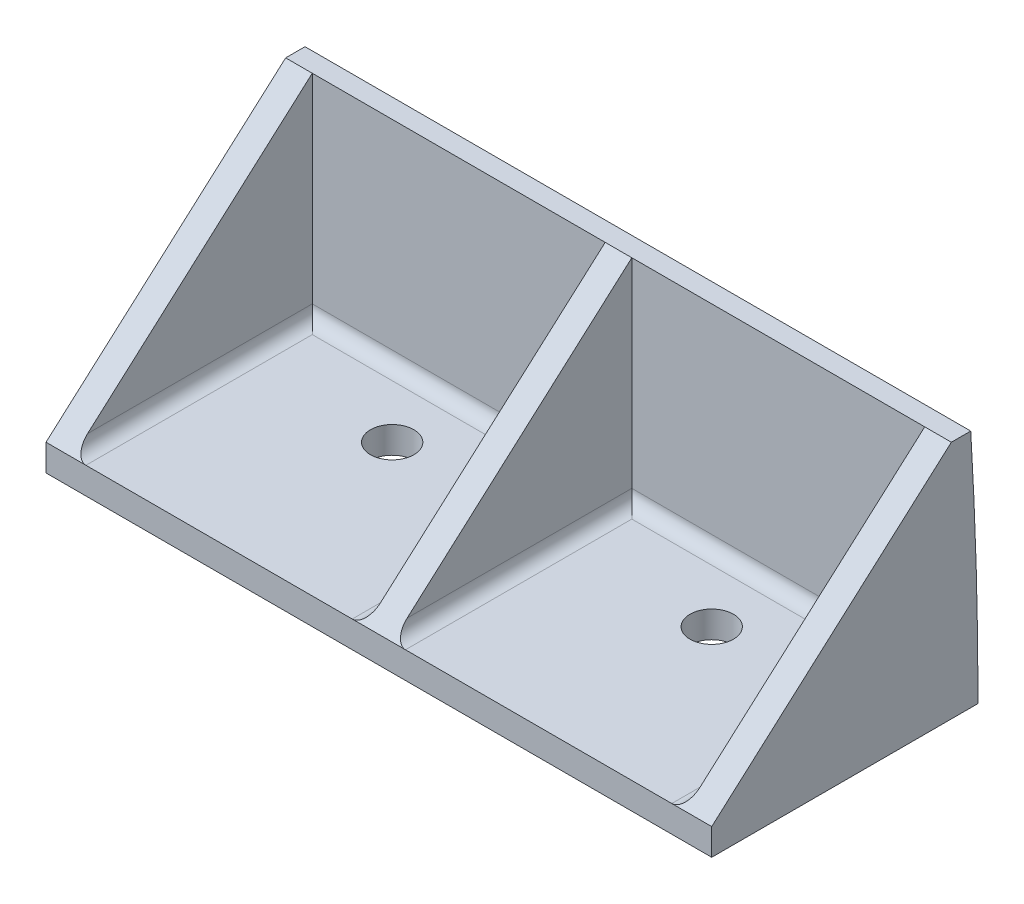
ISO-10303-21;
HEADER;
FILE_DESCRIPTION(('STEP AP214'),'2;1');
FILE_NAME('part.step','',(''),(''),'','','');
FILE_SCHEMA(('AUTOMOTIVE_DESIGN { 1 0 10303 214 1 1 1 1 }'));
ENDSEC;
DATA;
#1=APPLICATION_CONTEXT('core data for automotive mechanical design processes');
#2=APPLICATION_PROTOCOL_DEFINITION('international standard','automotive_design',2000,#1);
#3=PRODUCT_CONTEXT('',#1,'mechanical');
#4=PRODUCT('Part','Part','',(#3));
#5=PRODUCT_RELATED_PRODUCT_CATEGORY('part','',(#4));
#6=PRODUCT_DEFINITION_FORMATION('','',#4);
#7=PRODUCT_DEFINITION_CONTEXT('part definition',#1,'design');
#8=PRODUCT_DEFINITION('design','',#6,#7);
#9=PRODUCT_DEFINITION_SHAPE('','',#8);
#10=(LENGTH_UNIT() NAMED_UNIT(*) SI_UNIT(.MILLI.,.METRE.));
#11=(NAMED_UNIT(*) PLANE_ANGLE_UNIT() SI_UNIT($,.RADIAN.));
#12=(NAMED_UNIT(*) SI_UNIT($,.STERADIAN.) SOLID_ANGLE_UNIT());
#13=UNCERTAINTY_MEASURE_WITH_UNIT(LENGTH_MEASURE(1.E-05),#10,'distance_accuracy_value','');
#14=(GEOMETRIC_REPRESENTATION_CONTEXT(3) GLOBAL_UNCERTAINTY_ASSIGNED_CONTEXT((#13)) GLOBAL_UNIT_ASSIGNED_CONTEXT((#10,
#11,#12)) REPRESENTATION_CONTEXT('',''));
#15=CARTESIAN_POINT('',(0.,0.,0.));
#16=DIRECTION('',(0.,0.,1.));
#17=DIRECTION('',(1.,0.,0.));
#18=AXIS2_PLACEMENT_3D('',#15,#16,#17);
#19=CARTESIAN_POINT('',(-37.5,2.,-9.99999999999998));
#20=DIRECTION('',(-1.,0.,0.));
#21=DIRECTION('',(0.,0.,1.));
#22=AXIS2_PLACEMENT_3D('',#19,#20,#21);
#23=PLANE('',#22);
#24=CARTESIAN_POINT('',(-37.4999999999999,0.,287.));
#25=DIRECTION('',(1.,0.,0.));
#26=DIRECTION('',(0.,0.,-1.));
#27=AXIS2_PLACEMENT_3D('',#24,#25,#26);
#28=CIRCLE('',#27,297.);
#29=CARTESIAN_POINT('',(-37.5,0.,-10.));
#30=VERTEX_POINT('',#29);
#31=CARTESIAN_POINT('',(-37.5,18.,-9.45404365601088));
#32=VERTEX_POINT('',#31);
#33=EDGE_CURVE('E153',#30,#32,#28,.T.);
#34=ORIENTED_EDGE('',*,*,#33,.F.);
#35=DIRECTION('',(0.,0.,-1.));
#36=VECTOR('',#35,1.);
#37=CARTESIAN_POINT('',(-37.5,0.,-9.99999999999998));
#38=LINE('',#37,#36);
#39=CARTESIAN_POINT('',(-37.5,0.,10.));
#40=VERTEX_POINT('',#39);
#41=EDGE_CURVE('E168',#40,#30,#38,.T.);
#42=ORIENTED_EDGE('',*,*,#41,.F.);
#43=DIRECTION('',(0.,-1.,0.));
#44=VECTOR('',#43,1.);
#45=CARTESIAN_POINT('',(-37.5,2.,10.));
#46=LINE('',#45,#44);
#47=CARTESIAN_POINT('',(-37.5,2.,10.));
#48=VERTEX_POINT('',#47);
#49=EDGE_CURVE('E182',#48,#40,#46,.T.);
#50=ORIENTED_EDGE('',*,*,#49,.F.);
#51=DIRECTION('',(0.,-0.66436383882992,0.74740931868366));
#52=VECTOR('',#51,1.);
#53=CARTESIAN_POINT('',(-37.5,18.,-7.99999999999998));
#54=LINE('',#53,#52);
#55=CARTESIAN_POINT('',(-37.5,18.,-7.99999999999998));
#56=VERTEX_POINT('',#55);
#57=EDGE_CURVE('E333',#56,#48,#54,.T.);
#58=ORIENTED_EDGE('',*,*,#57,.F.);
#59=DIRECTION('',(0.,0.,-1.));
#60=VECTOR('',#59,1.);
#61=CARTESIAN_POINT('',(-37.5,18.,-9.99999999999998));
#62=LINE('',#61,#60);
#63=EDGE_CURVE('E170',#56,#32,#62,.T.);
#64=ORIENTED_EDGE('',*,*,#63,.T.);
#65=EDGE_LOOP('',(#34,#42,#50,#58,#64));
#66=FACE_BOUND('',#65,.T.);
#67=ADVANCED_FACE('F45',(#66),#23,.T.);
#68=CARTESIAN_POINT('',(-25.,2.,0.));
#69=DIRECTION('',(0.,1.,0.));
#70=DIRECTION('',(0.,0.,1.));
#71=AXIS2_PLACEMENT_3D('',#68,#69,#70);
#72=PLANE('',#71);
#73=DIRECTION('',(-1.,0.,0.));
#74=VECTOR('',#73,1.);
#75=CARTESIAN_POINT('',(-12.5,2.,10.));
#76=LINE('',#75,#74);
#77=CARTESIAN_POINT('',(-14.5,2.,10.));
#78=VERTEX_POINT('',#77);
#79=CARTESIAN_POINT('',(-34.5,2.,10.));
#80=VERTEX_POINT('',#79);
#81=EDGE_CURVE('E177',#78,#80,#76,.T.);
#82=ORIENTED_EDGE('',*,*,#81,.F.);
#83=DIRECTION('',(0.,0.,1.));
#84=VECTOR('',#83,1.);
#85=CARTESIAN_POINT('',(-14.5,2.,0.));
#86=LINE('',#85,#84);
#87=CARTESIAN_POINT('',(-14.5,2.,-7.));
#88=VERTEX_POINT('',#87);
#89=EDGE_CURVE('E292',#78,#88,#86,.F.);
#90=ORIENTED_EDGE('',*,*,#89,.T.);
#91=DIRECTION('',(-1.,0.,0.));
#92=VECTOR('',#91,1.);
#93=CARTESIAN_POINT('',(-35.5,2.,-6.99999999999999));
#94=LINE('',#93,#92);
#95=CARTESIAN_POINT('',(-34.5,2.,-6.99999999999999));
#96=VERTEX_POINT('',#95);
#97=EDGE_CURVE('E285',#88,#96,#94,.T.);
#98=ORIENTED_EDGE('',*,*,#97,.T.);
#99=DIRECTION('',(0.,0.,-1.));
#100=VECTOR('',#99,1.);
#101=CARTESIAN_POINT('',(-34.5,2.,10.));
#102=LINE('',#101,#100);
#103=EDGE_CURVE('E288',#96,#80,#102,.F.);
#104=ORIENTED_EDGE('',*,*,#103,.T.);
#105=EDGE_LOOP('',(#82,#90,#98,#104));
#106=FACE_BOUND('',#105,.T.);
#107=CARTESIAN_POINT('',(-24.5,2.,-2.99999999999999));
#108=DIRECTION('',(0.,1.,0.));
#109=DIRECTION('',(0.,0.,1.));
#110=AXIS2_PLACEMENT_3D('',#107,#108,#109);
#111=CIRCLE('',#110,1.63);
#112=CARTESIAN_POINT('',(-24.5,2.,-1.36999999999999));
#113=VERTEX_POINT('',#112);
#114=EDGE_CURVE('E318',#113,#113,#111,.F.);
#115=ORIENTED_EDGE('',*,*,#114,.T.);
#116=EDGE_LOOP('',(#115));
#117=FACE_BOUND('',#116,.T.);
#118=ADVANCED_FACE('F413',(#106,#117),#72,.T.);
#119=CARTESIAN_POINT('',(-12.5,18.,-8.));
#120=DIRECTION('',(0.,0.,1.));
#121=DIRECTION('',(1.,0.,0.));
#122=AXIS2_PLACEMENT_3D('',#119,#120,#121);
#123=PLANE('',#122);
#124=DIRECTION('',(0.,1.,0.));
#125=VECTOR('',#124,1.);
#126=CARTESIAN_POINT('',(-35.5,2.,-7.99999999999998));
#127=LINE('',#126,#125);
#128=CARTESIAN_POINT('',(-35.5,3.,-7.99999999999998));
#129=VERTEX_POINT('',#128);
#130=CARTESIAN_POINT('',(-35.5,18.,-7.99999999999999));
#131=VERTEX_POINT('',#130);
#132=EDGE_CURVE('E334',#129,#131,#127,.T.);
#133=ORIENTED_EDGE('',*,*,#132,.F.);
#134=DIRECTION('',(-1.,0.,0.));
#135=VECTOR('',#134,1.);
#136=CARTESIAN_POINT('',(-13.5,3.,-8.));
#137=LINE('',#136,#135);
#138=CARTESIAN_POINT('',(-13.5,3.,-8.));
#139=VERTEX_POINT('',#138);
#140=EDGE_CURVE('E298',#129,#139,#137,.F.);
#141=ORIENTED_EDGE('',*,*,#140,.T.);
#142=DIRECTION('',(0.,-1.,0.));
#143=VECTOR('',#142,1.);
#144=CARTESIAN_POINT('',(-13.5,18.,-8.));
#145=LINE('',#144,#143);
#146=CARTESIAN_POINT('',(-13.5,18.,-8.));
#147=VERTEX_POINT('',#146);
#148=EDGE_CURVE('E329',#147,#139,#145,.T.);
#149=ORIENTED_EDGE('',*,*,#148,.F.);
#150=DIRECTION('',(-1.,0.,0.));
#151=VECTOR('',#150,1.);
#152=CARTESIAN_POINT('',(-12.5,18.,-8.));
#153=LINE('',#152,#151);
#154=EDGE_CURVE('E178',#147,#131,#153,.T.);
#155=ORIENTED_EDGE('',*,*,#154,.T.);
#156=EDGE_LOOP('',(#133,#141,#149,#155));
#157=FACE_BOUND('',#156,.T.);
#158=ADVANCED_FACE('F407',(#157),#123,.T.);
#159=CARTESIAN_POINT('',(12.5,2.,-10.));
#160=DIRECTION('',(-1.,0.,0.));
#161=DIRECTION('',(0.,0.,1.));
#162=AXIS2_PLACEMENT_3D('',#159,#160,#161);
#163=PLANE('',#162);
#164=CARTESIAN_POINT('',(12.5000000000001,0.,287.));
#165=DIRECTION('',(1.,0.,0.));
#166=DIRECTION('',(0.,0.,-1.));
#167=AXIS2_PLACEMENT_3D('',#164,#165,#166);
#168=CIRCLE('',#167,297.);
#169=CARTESIAN_POINT('',(12.5,0.,-10.));
#170=VERTEX_POINT('',#169);
#171=CARTESIAN_POINT('',(12.5,18.,-9.45404365601088));
#172=VERTEX_POINT('',#171);
#173=EDGE_CURVE('E156',#170,#172,#168,.T.);
#174=ORIENTED_EDGE('',*,*,#173,.T.);
#175=DIRECTION('',(0.,0.,-1.));
#176=VECTOR('',#175,1.);
#177=CARTESIAN_POINT('',(12.5,18.,-10.));
#178=LINE('',#177,#176);
#179=CARTESIAN_POINT('',(12.5,18.,-8.));
#180=VERTEX_POINT('',#179);
#181=EDGE_CURVE('E231',#180,#172,#178,.T.);
#182=ORIENTED_EDGE('',*,*,#181,.F.);
#183=DIRECTION('',(0.,-0.66436383882992,0.74740931868366));
#184=VECTOR('',#183,1.);
#185=CARTESIAN_POINT('',(12.5,18.,-8.));
#186=LINE('',#185,#184);
#187=CARTESIAN_POINT('',(12.5,2.,10.));
#188=VERTEX_POINT('',#187);
#189=EDGE_CURVE('E208',#180,#188,#186,.T.);
#190=ORIENTED_EDGE('',*,*,#189,.T.);
#191=DIRECTION('',(0.,-1.,0.));
#192=VECTOR('',#191,1.);
#193=CARTESIAN_POINT('',(12.5,2.,10.));
#194=LINE('',#193,#192);
#195=CARTESIAN_POINT('',(12.5,0.,10.));
#196=VERTEX_POINT('',#195);
#197=EDGE_CURVE('E237',#188,#196,#194,.T.);
#198=ORIENTED_EDGE('',*,*,#197,.T.);
#199=DIRECTION('',(0.,0.,-1.));
#200=VECTOR('',#199,1.);
#201=CARTESIAN_POINT('',(12.5,0.,-10.));
#202=LINE('',#201,#200);
#203=EDGE_CURVE('E163',#196,#170,#202,.T.);
#204=ORIENTED_EDGE('',*,*,#203,.T.);
#205=EDGE_LOOP('',(#174,#182,#190,#198,#204));
#206=FACE_BOUND('',#205,.T.);
#207=ADVANCED_FACE('F364',(#206),#163,.F.);
#208=CARTESIAN_POINT('',(0.,18.,0.));
#209=DIRECTION('',(0.,1.,0.));
#210=DIRECTION('',(0.,0.,1.));
#211=AXIS2_PLACEMENT_3D('',#208,#209,#210);
#212=PLANE('',#211);
#213=DIRECTION('',(1.,0.,0.));
#214=VECTOR('',#213,1.);
#215=CARTESIAN_POINT('',(-12.5,18.,-9.45404365601088));
#216=LINE('',#215,#214);
#217=EDGE_CURVE('E272',#172,#32,#216,.F.);
#218=ORIENTED_EDGE('',*,*,#217,.T.);
#219=ORIENTED_EDGE('',*,*,#63,.F.);
#220=DIRECTION('',(-1.,0.,0.));
#221=VECTOR('',#220,1.);
#222=CARTESIAN_POINT('',(-35.5,18.,-7.99999999999998));
#223=LINE('',#222,#221);
#224=EDGE_CURVE('E345',#131,#56,#223,.T.);
#225=ORIENTED_EDGE('',*,*,#224,.F.);
#226=ORIENTED_EDGE('',*,*,#154,.F.);
#227=DIRECTION('',(1.,0.,0.));
#228=VECTOR('',#227,1.);
#229=CARTESIAN_POINT('',(-12.5,18.,-8.));
#230=LINE('',#229,#228);
#231=CARTESIAN_POINT('',(-11.5,18.,-8.));
#232=VERTEX_POINT('',#231);
#233=EDGE_CURVE('E227',#147,#232,#230,.T.);
#234=ORIENTED_EDGE('',*,*,#233,.T.);
#235=CARTESIAN_POINT('',(10.5,18.,-8.));
#236=VERTEX_POINT('',#235);
#237=EDGE_CURVE('E223',#232,#236,#230,.T.);
#238=ORIENTED_EDGE('',*,*,#237,.T.);
#239=DIRECTION('',(1.,0.,0.));
#240=VECTOR('',#239,1.);
#241=CARTESIAN_POINT('',(10.5,18.,-8.));
#242=LINE('',#241,#240);
#243=EDGE_CURVE('E216',#236,#180,#242,.T.);
#244=ORIENTED_EDGE('',*,*,#243,.T.);
#245=ORIENTED_EDGE('',*,*,#181,.T.);
#246=EDGE_LOOP('',(#218,#219,#225,#226,#234,#238,#244,#245));
#247=FACE_BOUND('',#246,.T.);
#248=ADVANCED_FACE('F361',(#247),#212,.T.);
#249=CARTESIAN_POINT('',(0.,2.,0.));
#250=DIRECTION('',(0.,1.,0.));
#251=DIRECTION('',(0.,0.,1.));
#252=AXIS2_PLACEMENT_3D('',#249,#250,#251);
#253=PLANE('',#252);
#254=CARTESIAN_POINT('',(-0.500000000000002,2.,-3.));
#255=DIRECTION('',(0.,1.,0.));
#256=DIRECTION('',(0.,0.,1.));
#257=AXIS2_PLACEMENT_3D('',#254,#255,#256);
#258=CIRCLE('',#257,1.63);
#259=CARTESIAN_POINT('',(-0.500000000000002,2.,-1.37));
#260=VERTEX_POINT('',#259);
#261=EDGE_CURVE('E196',#260,#260,#258,.T.);
#262=ORIENTED_EDGE('',*,*,#261,.F.);
#263=EDGE_LOOP('',(#262));
#264=FACE_BOUND('',#263,.T.);
#265=DIRECTION('',(1.,0.,0.));
#266=VECTOR('',#265,1.);
#267=CARTESIAN_POINT('',(0.,2.,-7.));
#268=LINE('',#267,#266);
#269=CARTESIAN_POINT('',(9.5,2.,-7.));
#270=VERTEX_POINT('',#269);
#271=CARTESIAN_POINT('',(-10.5,2.,-7.));
#272=VERTEX_POINT('',#271);
#273=EDGE_CURVE('E246',#270,#272,#268,.F.);
#274=ORIENTED_EDGE('',*,*,#273,.T.);
#275=DIRECTION('',(0.,0.,1.));
#276=VECTOR('',#275,1.);
#277=CARTESIAN_POINT('',(-10.5,2.,0.));
#278=LINE('',#277,#276);
#279=CARTESIAN_POINT('',(-10.5,2.,10.));
#280=VERTEX_POINT('',#279);
#281=EDGE_CURVE('E252',#272,#280,#278,.T.);
#282=ORIENTED_EDGE('',*,*,#281,.T.);
#283=DIRECTION('',(1.,0.,0.));
#284=VECTOR('',#283,1.);
#285=CARTESIAN_POINT('',(-12.5,2.,10.));
#286=LINE('',#285,#284);
#287=CARTESIAN_POINT('',(9.5,2.,10.));
#288=VERTEX_POINT('',#287);
#289=EDGE_CURVE('E238',#280,#288,#286,.T.);
#290=ORIENTED_EDGE('',*,*,#289,.T.);
#291=DIRECTION('',(0.,0.,-1.));
#292=VECTOR('',#291,1.);
#293=CARTESIAN_POINT('',(9.5,2.,-7.99999999999999));
#294=LINE('',#293,#292);
#295=EDGE_CURVE('E249',#288,#270,#294,.T.);
#296=ORIENTED_EDGE('',*,*,#295,.T.);
#297=EDGE_LOOP('',(#274,#282,#290,#296));
#298=FACE_BOUND('',#297,.T.);
#299=ADVANCED_FACE('F369',(#264,#298),#253,.T.);
#300=CARTESIAN_POINT('',(-12.5,18.,-8.));
#301=DIRECTION('',(0.,0.,-1.));
#302=DIRECTION('',(-1.,0.,0.));
#303=AXIS2_PLACEMENT_3D('',#300,#301,#302);
#304=PLANE('',#303);
#305=DIRECTION('',(0.,-1.,0.));
#306=VECTOR('',#305,1.);
#307=CARTESIAN_POINT('',(-11.5,18.,-8.));
#308=LINE('',#307,#306);
#309=CARTESIAN_POINT('',(-11.5,3.,-8.));
#310=VERTEX_POINT('',#309);
#311=EDGE_CURVE('E204',#232,#310,#308,.T.);
#312=ORIENTED_EDGE('',*,*,#311,.T.);
#313=DIRECTION('',(1.,0.,0.));
#314=VECTOR('',#313,1.);
#315=CARTESIAN_POINT('',(-12.5,3.,-8.));
#316=LINE('',#315,#314);
#317=CARTESIAN_POINT('',(10.5,3.,-7.99999999999999));
#318=VERTEX_POINT('',#317);
#319=EDGE_CURVE('E262',#310,#318,#316,.T.);
#320=ORIENTED_EDGE('',*,*,#319,.T.);
#321=DIRECTION('',(0.,1.,0.));
#322=VECTOR('',#321,1.);
#323=CARTESIAN_POINT('',(10.5,2.,-7.99999999999999));
#324=LINE('',#323,#322);
#325=EDGE_CURVE('E209',#318,#236,#324,.T.);
#326=ORIENTED_EDGE('',*,*,#325,.T.);
#327=ORIENTED_EDGE('',*,*,#237,.F.);
#328=EDGE_LOOP('',(#312,#320,#326,#327));
#329=FACE_BOUND('',#328,.T.);
#330=ADVANCED_FACE('F400',(#329),#304,.F.);
#331=CARTESIAN_POINT('',(-12.5,2.,10.));
#332=DIRECTION('',(0.,0.,-1.));
#333=DIRECTION('',(-1.,0.,0.));
#334=AXIS2_PLACEMENT_3D('',#331,#332,#333);
#335=PLANE('',#334);
#336=DIRECTION('',(1.,0.,0.));
#337=VECTOR('',#336,1.);
#338=CARTESIAN_POINT('',(-12.5,0.,10.));
#339=LINE('',#338,#337);
#340=EDGE_CURVE('E162',#40,#196,#339,.T.);
#341=ORIENTED_EDGE('',*,*,#340,.T.);
#342=ORIENTED_EDGE('',*,*,#197,.F.);
#343=DIRECTION('',(1.,0.,0.));
#344=VECTOR('',#343,1.);
#345=CARTESIAN_POINT('',(10.5,2.,10.));
#346=LINE('',#345,#344);
#347=EDGE_CURVE('E220',#288,#188,#346,.T.);
#348=ORIENTED_EDGE('',*,*,#347,.F.);
#349=ORIENTED_EDGE('',*,*,#289,.F.);
#350=EDGE_CURVE('E64',#78,#280,#286,.T.);
#351=ORIENTED_EDGE('',*,*,#350,.F.);
#352=ORIENTED_EDGE('',*,*,#81,.T.);
#353=DIRECTION('',(-1.,0.,0.));
#354=VECTOR('',#353,1.);
#355=CARTESIAN_POINT('',(-35.5,2.,10.));
#356=LINE('',#355,#354);
#357=EDGE_CURVE('E341',#80,#48,#356,.T.);
#358=ORIENTED_EDGE('',*,*,#357,.T.);
#359=ORIENTED_EDGE('',*,*,#49,.T.);
#360=EDGE_LOOP('',(#341,#342,#348,#349,#351,#352,#358,#359));
#361=FACE_BOUND('',#360,.T.);
#362=ADVANCED_FACE('F353',(#361),#335,.F.);
#363=CARTESIAN_POINT('',(0.,0.,0.));
#364=DIRECTION('',(0.,1.,0.));
#365=DIRECTION('',(0.,0.,1.));
#366=AXIS2_PLACEMENT_3D('',#363,#364,#365);
#367=PLANE('',#366);
#368=CARTESIAN_POINT('',(-24.5,0.,-2.99999999999999));
#369=DIRECTION('',(0.,-1.,0.));
#370=DIRECTION('',(0.,0.,1.));
#371=AXIS2_PLACEMENT_3D('',#368,#369,#370);
#372=CIRCLE('',#371,1.63);
#373=CARTESIAN_POINT('',(-24.5,0.,-1.36999999999999));
#374=VERTEX_POINT('',#373);
#375=EDGE_CURVE('E311',#374,#374,#372,.T.);
#376=ORIENTED_EDGE('',*,*,#375,.F.);
#377=EDGE_LOOP('',(#376));
#378=FACE_BOUND('',#377,.T.);
#379=CARTESIAN_POINT('',(-0.500000000000002,0.,-3.));
#380=DIRECTION('',(0.,1.,0.));
#381=DIRECTION('',(0.,0.,1.));
#382=AXIS2_PLACEMENT_3D('',#379,#380,#381);
#383=CIRCLE('',#382,1.63);
#384=CARTESIAN_POINT('',(-0.500000000000002,0.,-1.37));
#385=VERTEX_POINT('',#384);
#386=EDGE_CURVE('E192',#385,#385,#383,.T.);
#387=ORIENTED_EDGE('',*,*,#386,.T.);
#388=EDGE_LOOP('',(#387));
#389=FACE_BOUND('',#388,.T.);
#390=ORIENTED_EDGE('',*,*,#203,.F.);
#391=ORIENTED_EDGE('',*,*,#340,.F.);
#392=ORIENTED_EDGE('',*,*,#41,.T.);
#393=DIRECTION('',(-1.,0.,0.));
#394=VECTOR('',#393,1.);
#395=CARTESIAN_POINT('',(-12.5,0.,-10.));
#396=LINE('',#395,#394);
#397=EDGE_CURVE('E150',#170,#30,#396,.T.);
#398=ORIENTED_EDGE('',*,*,#397,.F.);
#399=EDGE_LOOP('',(#390,#391,#392,#398));
#400=FACE_BOUND('',#399,.T.);
#401=ADVANCED_FACE('F174',(#378,#389,#400),#367,.F.);
#402=CARTESIAN_POINT('',(10.5,18.,-8.));
#403=DIRECTION('',(0.,0.74740931868366,0.66436383882992));
#404=DIRECTION('',(0.,-0.66436383882992,0.74740931868366));
#405=AXIS2_PLACEMENT_3D('',#402,#403,#404);
#406=PLANE('',#405);
#407=ORIENTED_EDGE('',*,*,#189,.F.);
#408=ORIENTED_EDGE('',*,*,#243,.F.);
#409=DIRECTION('',(0.,-0.66436383882992,0.74740931868366));
#410=VECTOR('',#409,1.);
#411=CARTESIAN_POINT('',(10.5,18.,-8.));
#412=LINE('',#411,#410);
#413=CARTESIAN_POINT('',(10.5,3.,8.87500000000001));
#414=VERTEX_POINT('',#413);
#415=EDGE_CURVE('E212',#236,#414,#412,.T.);
#416=ORIENTED_EDGE('',*,*,#415,.T.);
#417=CARTESIAN_POINT('',(9.50000000000001,3.,8.87500000000001));
#418=DIRECTION('',(0.,0.74740931868366,0.66436383882992));
#419=DIRECTION('',(0.,-0.66436383882992,0.74740931868366));
#420=AXIS2_PLACEMENT_3D('',#417,#418,#419);
#421=ELLIPSE('',#420,1.50519932234904,1.);
#422=EDGE_CURVE('E268',#414,#288,#421,.F.);
#423=ORIENTED_EDGE('',*,*,#422,.T.);
#424=ORIENTED_EDGE('',*,*,#347,.T.);
#425=EDGE_LOOP('',(#407,#408,#416,#423,#424));
#426=FACE_BOUND('',#425,.T.);
#427=ADVANCED_FACE('F375',(#426),#406,.T.);
#428=CARTESIAN_POINT('',(10.5,0.,0.));
#429=DIRECTION('',(-1.,0.,0.));
#430=DIRECTION('',(0.,0.,1.));
#431=AXIS2_PLACEMENT_3D('',#428,#429,#430);
#432=PLANE('',#431);
#433=ORIENTED_EDGE('',*,*,#325,.F.);
#434=DIRECTION('',(0.,0.,-1.));
#435=VECTOR('',#434,1.);
#436=CARTESIAN_POINT('',(10.5,3.,10.));
#437=LINE('',#436,#435);
#438=EDGE_CURVE('E259',#318,#414,#437,.F.);
#439=ORIENTED_EDGE('',*,*,#438,.T.);
#440=ORIENTED_EDGE('',*,*,#415,.F.);
#441=EDGE_LOOP('',(#433,#439,#440));
#442=FACE_BOUND('',#441,.T.);
#443=ADVANCED_FACE('F448',(#442),#432,.T.);
#444=CARTESIAN_POINT('',(-11.5,2.,10.));
#445=DIRECTION('',(0.,0.74740931868366,0.66436383882992));
#446=DIRECTION('',(0.,-0.66436383882992,0.74740931868366));
#447=AXIS2_PLACEMENT_3D('',#444,#445,#446);
#448=PLANE('',#447);
#449=ORIENTED_EDGE('',*,*,#233,.F.);
#450=DIRECTION('',(0.,0.66436383882992,-0.74740931868366));
#451=VECTOR('',#450,1.);
#452=CARTESIAN_POINT('',(-13.5,2.,10.));
#453=LINE('',#452,#451);
#454=CARTESIAN_POINT('',(-13.5,3.,8.875));
#455=VERTEX_POINT('',#454);
#456=EDGE_CURVE('E324',#455,#147,#453,.T.);
#457=ORIENTED_EDGE('',*,*,#456,.F.);
#458=CARTESIAN_POINT('',(-14.5,3.,8.875));
#459=DIRECTION('',(0.,0.74740931868366,0.66436383882992));
#460=DIRECTION('',(0.,-0.66436383882992,0.74740931868366));
#461=AXIS2_PLACEMENT_3D('',#458,#459,#460);
#462=ELLIPSE('',#461,1.50519932234904,1.);
#463=EDGE_CURVE('E56',#455,#78,#462,.F.);
#464=ORIENTED_EDGE('',*,*,#463,.T.);
#465=ORIENTED_EDGE('',*,*,#350,.T.);
#466=CARTESIAN_POINT('',(-10.5,3.,8.875));
#467=DIRECTION('',(0.,0.74740931868366,0.66436383882992));
#468=DIRECTION('',(0.,-0.66436383882992,0.74740931868366));
#469=AXIS2_PLACEMENT_3D('',#466,#467,#468);
#470=ELLIPSE('',#469,1.50519932234904,1.);
#471=CARTESIAN_POINT('',(-11.5,3.,8.875));
#472=VERTEX_POINT('',#471);
#473=EDGE_CURVE('E265',#280,#472,#470,.F.);
#474=ORIENTED_EDGE('',*,*,#473,.T.);
#475=DIRECTION('',(0.,0.66436383882992,-0.74740931868366));
#476=VECTOR('',#475,1.);
#477=CARTESIAN_POINT('',(-11.5,2.,10.));
#478=LINE('',#477,#476);
#479=EDGE_CURVE('E201',#472,#232,#478,.T.);
#480=ORIENTED_EDGE('',*,*,#479,.T.);
#481=EDGE_LOOP('',(#449,#457,#464,#465,#474,#480));
#482=FACE_BOUND('',#481,.T.);
#483=ADVANCED_FACE('F393',(#482),#448,.T.);
#484=CARTESIAN_POINT('',(-11.5,0.,0.));
#485=DIRECTION('',(-1.,0.,0.));
#486=DIRECTION('',(0.,0.,1.));
#487=AXIS2_PLACEMENT_3D('',#484,#485,#486);
#488=PLANE('',#487);
#489=ORIENTED_EDGE('',*,*,#479,.F.);
#490=DIRECTION('',(0.,0.,1.));
#491=VECTOR('',#490,1.);
#492=CARTESIAN_POINT('',(-11.5,3.,0.));
#493=LINE('',#492,#491);
#494=EDGE_CURVE('E256',#472,#310,#493,.F.);
#495=ORIENTED_EDGE('',*,*,#494,.T.);
#496=ORIENTED_EDGE('',*,*,#311,.F.);
#497=EDGE_LOOP('',(#489,#495,#496));
#498=FACE_BOUND('',#497,.T.);
#499=ADVANCED_FACE('F396',(#498),#488,.F.);
#500=CARTESIAN_POINT('',(-0.500000000000002,0.,-3.));
#501=DIRECTION('',(0.,1.,0.));
#502=DIRECTION('',(0.,0.,1.));
#503=AXIS2_PLACEMENT_3D('',#500,#501,#502);
#504=CYLINDRICAL_SURFACE('',#503,1.63);
#505=ORIENTED_EDGE('',*,*,#261,.T.);
#506=EDGE_LOOP('',(#505));
#507=FACE_BOUND('',#506,.T.);
#508=ORIENTED_EDGE('',*,*,#386,.F.);
#509=EDGE_LOOP('',(#508));
#510=FACE_BOUND('',#509,.T.);
#511=ADVANCED_FACE('F440',(#507,#510),#504,.F.);
#512=CARTESIAN_POINT('',(9.5,3.,0.));
#513=DIRECTION('',(0.,0.,1.));
#514=DIRECTION('',(1.,0.,0.));
#515=AXIS2_PLACEMENT_3D('',#512,#513,#514);
#516=CYLINDRICAL_SURFACE('',#515,1.);
#517=ORIENTED_EDGE('',*,*,#422,.F.);
#518=ORIENTED_EDGE('',*,*,#438,.F.);
#519=CARTESIAN_POINT('',(9.5,3.,-7.));
#520=DIRECTION('',(0.707106781186548,0.,0.707106781186547));
#521=DIRECTION('',(-0.707106781186547,0.,0.707106781186548));
#522=AXIS2_PLACEMENT_3D('',#519,#520,#521);
#523=ELLIPSE('',#522,1.41421356237309,1.);
#524=EDGE_CURVE('E197',#270,#318,#523,.T.);
#525=ORIENTED_EDGE('',*,*,#524,.F.);
#526=ORIENTED_EDGE('',*,*,#295,.F.);
#527=EDGE_LOOP('',(#517,#518,#525,#526));
#528=FACE_BOUND('',#527,.T.);
#529=ADVANCED_FACE('F380',(#528),#516,.F.);
#530=CARTESIAN_POINT('',(-12.5,3.,-7.));
#531=DIRECTION('',(1.,0.,0.));
#532=DIRECTION('',(0.,0.,-1.));
#533=AXIS2_PLACEMENT_3D('',#530,#531,#532);
#534=CYLINDRICAL_SURFACE('',#533,1.);
#535=ORIENTED_EDGE('',*,*,#524,.T.);
#536=ORIENTED_EDGE('',*,*,#319,.F.);
#537=CARTESIAN_POINT('',(-10.5,3.,-7.));
#538=DIRECTION('',(-0.707106781186547,0.,0.707106781186548));
#539=DIRECTION('',(0.707106781186548,0.,0.707106781186547));
#540=AXIS2_PLACEMENT_3D('',#537,#538,#539);
#541=ELLIPSE('',#540,1.4142135623731,1.);
#542=EDGE_CURVE('E191',#272,#310,#541,.F.);
#543=ORIENTED_EDGE('',*,*,#542,.F.);
#544=ORIENTED_EDGE('',*,*,#273,.F.);
#545=EDGE_LOOP('',(#535,#536,#543,#544));
#546=FACE_BOUND('',#545,.T.);
#547=ADVANCED_FACE('F385',(#546),#534,.F.);
#548=CARTESIAN_POINT('',(-10.5,3.,0.));
#549=DIRECTION('',(0.,0.,1.));
#550=DIRECTION('',(1.,0.,0.));
#551=AXIS2_PLACEMENT_3D('',#548,#549,#550);
#552=CYLINDRICAL_SURFACE('',#551,1.);
#553=ORIENTED_EDGE('',*,*,#542,.T.);
#554=ORIENTED_EDGE('',*,*,#494,.F.);
#555=ORIENTED_EDGE('',*,*,#473,.F.);
#556=ORIENTED_EDGE('',*,*,#281,.F.);
#557=EDGE_LOOP('',(#553,#554,#555,#556));
#558=FACE_BOUND('',#557,.T.);
#559=ADVANCED_FACE('F389',(#558),#552,.F.);
#560=CARTESIAN_POINT('',(-12.4999999999999,0.,287.));
#561=DIRECTION('',(1.,0.,0.));
#562=DIRECTION('',(0.,0.,-1.));
#563=AXIS2_PLACEMENT_3D('',#560,#561,#562);
#564=CYLINDRICAL_SURFACE('',#563,297.);
#565=ORIENTED_EDGE('',*,*,#397,.T.);
#566=ORIENTED_EDGE('',*,*,#33,.T.);
#567=ORIENTED_EDGE('',*,*,#217,.F.);
#568=ORIENTED_EDGE('',*,*,#173,.F.);
#569=EDGE_LOOP('',(#565,#566,#567,#568));
#570=FACE_BOUND('',#569,.T.);
#571=ADVANCED_FACE('F152',(#570),#564,.T.);
#572=CARTESIAN_POINT('',(-35.5,18.,-7.99999999999998));
#573=DIRECTION('',(0.,-0.74740931868366,-0.66436383882992));
#574=DIRECTION('',(0.,0.66436383882992,-0.74740931868366));
#575=AXIS2_PLACEMENT_3D('',#572,#573,#574);
#576=PLANE('',#575);
#577=ORIENTED_EDGE('',*,*,#57,.T.);
#578=ORIENTED_EDGE('',*,*,#357,.F.);
#579=CARTESIAN_POINT('',(-34.5,3.,8.87500000000003));
#580=DIRECTION('',(0.,-0.74740931868366,-0.66436383882992));
#581=DIRECTION('',(0.,-0.66436383882992,0.74740931868366));
#582=AXIS2_PLACEMENT_3D('',#579,#580,#581);
#583=ELLIPSE('',#582,1.50519932234904,1.);
#584=CARTESIAN_POINT('',(-35.5,3.,8.87500000000003));
#585=VERTEX_POINT('',#584);
#586=EDGE_CURVE('E11',#80,#585,#583,.T.);
#587=ORIENTED_EDGE('',*,*,#586,.T.);
#588=DIRECTION('',(0.,-0.66436383882992,0.74740931868366));
#589=VECTOR('',#588,1.);
#590=CARTESIAN_POINT('',(-35.5,18.,-7.99999999999998));
#591=LINE('',#590,#589);
#592=EDGE_CURVE('E337',#131,#585,#591,.T.);
#593=ORIENTED_EDGE('',*,*,#592,.F.);
#594=ORIENTED_EDGE('',*,*,#224,.T.);
#595=EDGE_LOOP('',(#577,#578,#587,#593,#594));
#596=FACE_BOUND('',#595,.T.);
#597=ADVANCED_FACE('F356',(#596),#576,.F.);
#598=CARTESIAN_POINT('',(-35.5,0.,0.));
#599=DIRECTION('',(1.,0.,0.));
#600=DIRECTION('',(0.,0.,1.));
#601=AXIS2_PLACEMENT_3D('',#598,#599,#600);
#602=PLANE('',#601);
#603=ORIENTED_EDGE('',*,*,#592,.T.);
#604=DIRECTION('',(0.,0.,-1.));
#605=VECTOR('',#604,1.);
#606=CARTESIAN_POINT('',(-35.5,3.,-7.99999999999999));
#607=LINE('',#606,#605);
#608=EDGE_CURVE('E295',#585,#129,#607,.T.);
#609=ORIENTED_EDGE('',*,*,#608,.T.);
#610=ORIENTED_EDGE('',*,*,#132,.T.);
#611=EDGE_LOOP('',(#603,#609,#610));
#612=FACE_BOUND('',#611,.T.);
#613=ADVANCED_FACE('F419',(#612),#602,.T.);
#614=CARTESIAN_POINT('',(-13.5,0.,0.));
#615=DIRECTION('',(1.,0.,0.));
#616=DIRECTION('',(0.,0.,1.));
#617=AXIS2_PLACEMENT_3D('',#614,#615,#616);
#618=PLANE('',#617);
#619=ORIENTED_EDGE('',*,*,#148,.T.);
#620=DIRECTION('',(0.,0.,1.));
#621=VECTOR('',#620,1.);
#622=CARTESIAN_POINT('',(-13.5,3.,0.));
#623=LINE('',#622,#621);
#624=EDGE_CURVE('E281',#139,#455,#623,.T.);
#625=ORIENTED_EDGE('',*,*,#624,.T.);
#626=ORIENTED_EDGE('',*,*,#456,.T.);
#627=EDGE_LOOP('',(#619,#625,#626));
#628=FACE_BOUND('',#627,.T.);
#629=ADVANCED_FACE('F409',(#628),#618,.F.);
#630=CARTESIAN_POINT('',(-24.5,0.,-2.99999999999999));
#631=DIRECTION('',(0.,1.,0.));
#632=DIRECTION('',(0.,0.,1.));
#633=AXIS2_PLACEMENT_3D('',#630,#631,#632);
#634=CYLINDRICAL_SURFACE('',#633,1.63);
#635=ORIENTED_EDGE('',*,*,#114,.F.);
#636=EDGE_LOOP('',(#635));
#637=FACE_BOUND('',#636,.T.);
#638=ORIENTED_EDGE('',*,*,#375,.T.);
#639=EDGE_LOOP('',(#638));
#640=FACE_BOUND('',#639,.T.);
#641=ADVANCED_FACE('F426',(#637,#640),#634,.F.);
#642=CARTESIAN_POINT('',(-34.5,3.,0.));
#643=DIRECTION('',(0.,0.,1.));
#644=DIRECTION('',(1.,0.,0.));
#645=AXIS2_PLACEMENT_3D('',#642,#643,#644);
#646=CYLINDRICAL_SURFACE('',#645,1.);
#647=ORIENTED_EDGE('',*,*,#586,.F.);
#648=ORIENTED_EDGE('',*,*,#103,.F.);
#649=CARTESIAN_POINT('',(-34.5,3.,-6.99999999999999));
#650=DIRECTION('',(-0.707106781186547,0.,0.707106781186548));
#651=DIRECTION('',(0.707106781186548,0.,0.707106781186547));
#652=AXIS2_PLACEMENT_3D('',#649,#650,#651);
#653=ELLIPSE('',#652,1.41421356237309,1.);
#654=EDGE_CURVE('E49',#129,#96,#653,.T.);
#655=ORIENTED_EDGE('',*,*,#654,.F.);
#656=ORIENTED_EDGE('',*,*,#608,.F.);
#657=EDGE_LOOP('',(#647,#648,#655,#656));
#658=FACE_BOUND('',#657,.T.);
#659=ADVANCED_FACE('F47',(#658),#646,.F.);
#660=CARTESIAN_POINT('',(-25.,3.,-6.99999999999999));
#661=DIRECTION('',(1.,0.,0.));
#662=DIRECTION('',(0.,0.,-1.));
#663=AXIS2_PLACEMENT_3D('',#660,#661,#662);
#664=CYLINDRICAL_SURFACE('',#663,1.);
#665=ORIENTED_EDGE('',*,*,#654,.T.);
#666=ORIENTED_EDGE('',*,*,#97,.F.);
#667=CARTESIAN_POINT('',(-14.5,3.,-7.));
#668=DIRECTION('',(0.707106781186548,0.,0.707106781186547));
#669=DIRECTION('',(-0.707106781186547,0.,0.707106781186548));
#670=AXIS2_PLACEMENT_3D('',#667,#668,#669);
#671=ELLIPSE('',#670,1.4142135623731,1.);
#672=EDGE_CURVE('E172',#139,#88,#671,.F.);
#673=ORIENTED_EDGE('',*,*,#672,.F.);
#674=ORIENTED_EDGE('',*,*,#140,.F.);
#675=EDGE_LOOP('',(#665,#666,#673,#674));
#676=FACE_BOUND('',#675,.T.);
#677=ADVANCED_FACE('F410',(#676),#664,.F.);
#678=CARTESIAN_POINT('',(-14.5,3.,0.));
#679=DIRECTION('',(0.,0.,1.));
#680=DIRECTION('',(1.,0.,0.));
#681=AXIS2_PLACEMENT_3D('',#678,#679,#680);
#682=CYLINDRICAL_SURFACE('',#681,1.);
#683=ORIENTED_EDGE('',*,*,#672,.T.);
#684=ORIENTED_EDGE('',*,*,#89,.F.);
#685=ORIENTED_EDGE('',*,*,#463,.F.);
#686=ORIENTED_EDGE('',*,*,#624,.F.);
#687=EDGE_LOOP('',(#683,#684,#685,#686));
#688=FACE_BOUND('',#687,.T.);
#689=ADVANCED_FACE('F411',(#688),#682,.F.);
#690=CLOSED_SHELL('',(#67,#118,#158,#207,#248,#299,#330,#362,#401,#427,#443,#483,#499,#511,#529,
#547,#559,#571,#597,#613,#629,#641,#659,#677,#689));
#691=MANIFOLD_SOLID_BREP('B2',#690);
#692=ADVANCED_BREP_SHAPE_REPRESENTATION('',(#18,#691),#14);
#693=SHAPE_DEFINITION_REPRESENTATION(#9,#692);
ENDSEC;
END-ISO-10303-21;
